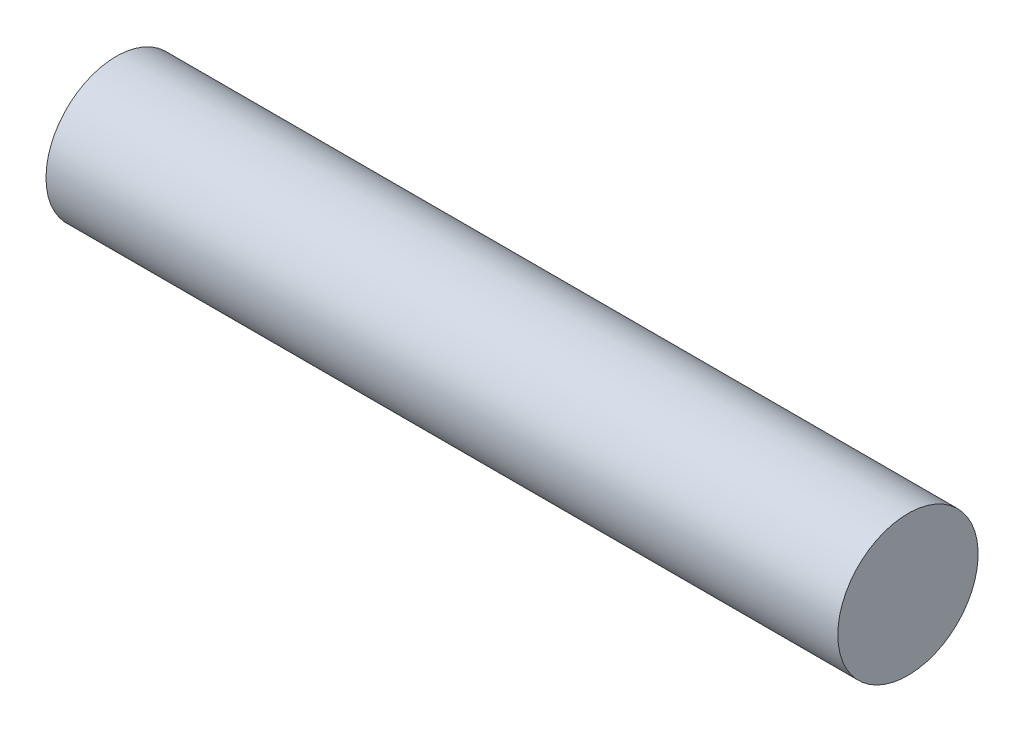
ISO-10303-21;
HEADER;
FILE_DESCRIPTION(('STEP AP214'),'2;1');
FILE_NAME('part.step','',(''),(''),'','','');
FILE_SCHEMA(('AUTOMOTIVE_DESIGN { 1 0 10303 214 1 1 1 1 }'));
ENDSEC;
DATA;
#1=APPLICATION_CONTEXT('core data for automotive mechanical design processes');
#2=APPLICATION_PROTOCOL_DEFINITION('international standard','automotive_design',2000,#1);
#3=PRODUCT_CONTEXT('',#1,'mechanical');
#4=PRODUCT('Part','Part','',(#3));
#5=PRODUCT_RELATED_PRODUCT_CATEGORY('part','',(#4));
#6=PRODUCT_DEFINITION_FORMATION('','',#4);
#7=PRODUCT_DEFINITION_CONTEXT('part definition',#1,'design');
#8=PRODUCT_DEFINITION('design','',#6,#7);
#9=PRODUCT_DEFINITION_SHAPE('','',#8);
#10=(LENGTH_UNIT() NAMED_UNIT(*) SI_UNIT(.MILLI.,.METRE.));
#11=(NAMED_UNIT(*) PLANE_ANGLE_UNIT() SI_UNIT($,.RADIAN.));
#12=(NAMED_UNIT(*) SI_UNIT($,.STERADIAN.) SOLID_ANGLE_UNIT());
#13=UNCERTAINTY_MEASURE_WITH_UNIT(LENGTH_MEASURE(1.E-05),#10,'distance_accuracy_value','');
#14=(GEOMETRIC_REPRESENTATION_CONTEXT(3) GLOBAL_UNCERTAINTY_ASSIGNED_CONTEXT((#13)) GLOBAL_UNIT_ASSIGNED_CONTEXT((#10,
#11,#12)) REPRESENTATION_CONTEXT('',''));
#15=CARTESIAN_POINT('',(0.,0.,0.));
#16=DIRECTION('',(0.,0.,1.));
#17=DIRECTION('',(1.,0.,0.));
#18=AXIS2_PLACEMENT_3D('',#15,#16,#17);
#19=CARTESIAN_POINT('',(0.,0.,0.));
#20=DIRECTION('',(1.,0.,0.));
#21=DIRECTION('',(0.,0.,-1.));
#22=AXIS2_PLACEMENT_3D('',#19,#20,#21);
#23=PLANE('',#22);
#24=CARTESIAN_POINT('',(0.,0.,0.));
#25=DIRECTION('',(-1.,0.,0.));
#26=DIRECTION('',(0.,0.,1.));
#27=AXIS2_PLACEMENT_3D('',#24,#25,#26);
#28=CIRCLE('',#27,7.);
#29=CARTESIAN_POINT('',(0.,0.,7.));
#30=VERTEX_POINT('',#29);
#31=EDGE_CURVE('E10',#30,#30,#28,.T.);
#32=ORIENTED_EDGE('',*,*,#31,.T.);
#33=EDGE_LOOP('',(#32));
#34=FACE_BOUND('',#33,.T.);
#35=ADVANCED_FACE('F39',(#34),#23,.F.);
#36=CARTESIAN_POINT('',(0.,0.,0.));
#37=DIRECTION('',(-1.,0.,0.));
#38=DIRECTION('',(0.,0.,1.));
#39=AXIS2_PLACEMENT_3D('',#36,#37,#38);
#40=CYLINDRICAL_SURFACE('',#39,7.);
#41=ORIENTED_EDGE('',*,*,#31,.F.);
#42=EDGE_LOOP('',(#41));
#43=FACE_BOUND('',#42,.T.);
#44=CARTESIAN_POINT('',(79.,0.,0.));
#45=DIRECTION('',(-1.,0.,0.));
#46=DIRECTION('',(0.,0.,1.));
#47=AXIS2_PLACEMENT_3D('',#44,#45,#46);
#48=CIRCLE('',#47,7.);
#49=CARTESIAN_POINT('',(79.,0.,7.));
#50=VERTEX_POINT('',#49);
#51=EDGE_CURVE('E45',#50,#50,#48,.T.);
#52=ORIENTED_EDGE('',*,*,#51,.T.);
#53=EDGE_LOOP('',(#52));
#54=FACE_BOUND('',#53,.T.);
#55=ADVANCED_FACE('F51',(#43,#54),#40,.T.);
#56=CARTESIAN_POINT('',(79.,7.,0.));
#57=DIRECTION('',(-1.,0.,0.));
#58=DIRECTION('',(0.,0.,1.));
#59=AXIS2_PLACEMENT_3D('',#56,#57,#58);
#60=PLANE('',#59);
#61=ORIENTED_EDGE('',*,*,#51,.F.);
#62=EDGE_LOOP('',(#61));
#63=FACE_BOUND('',#62,.T.);
#64=ADVANCED_FACE('F53',(#63),#60,.F.);
#65=CLOSED_SHELL('',(#35,#55,#64));
#66=MANIFOLD_SOLID_BREP('B2',#65);
#67=ADVANCED_BREP_SHAPE_REPRESENTATION('',(#18,#66),#14);
#68=SHAPE_DEFINITION_REPRESENTATION(#9,#67);
ENDSEC;
END-ISO-10303-21;
